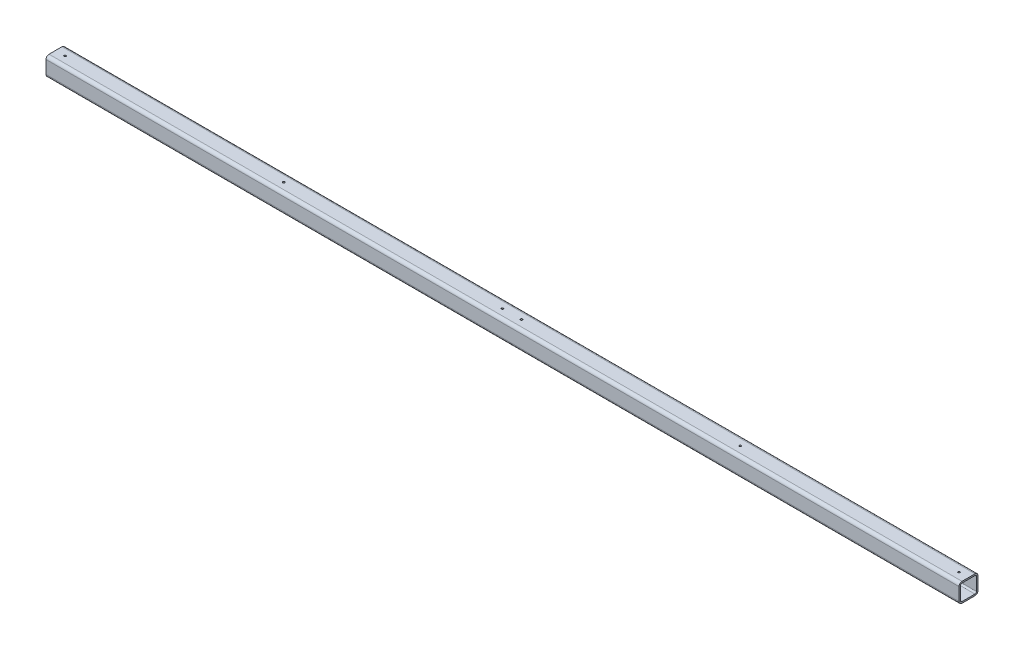
ISO-10303-21;
HEADER;
FILE_DESCRIPTION(('STEP AP214'),'2;1');
FILE_NAME('part.step','',(''),(''),'','','');
FILE_SCHEMA(('AUTOMOTIVE_DESIGN { 1 0 10303 214 1 1 1 1 }'));
ENDSEC;
DATA;
#1=APPLICATION_CONTEXT('core data for automotive mechanical design processes');
#2=APPLICATION_PROTOCOL_DEFINITION('international standard','automotive_design',2000,#1);
#3=PRODUCT_CONTEXT('',#1,'mechanical');
#4=PRODUCT('Part','Part','',(#3));
#5=PRODUCT_RELATED_PRODUCT_CATEGORY('part','',(#4));
#6=PRODUCT_DEFINITION_FORMATION('','',#4);
#7=PRODUCT_DEFINITION_CONTEXT('part definition',#1,'design');
#8=PRODUCT_DEFINITION('design','',#6,#7);
#9=PRODUCT_DEFINITION_SHAPE('','',#8);
#10=(LENGTH_UNIT() NAMED_UNIT(*) SI_UNIT(.MILLI.,.METRE.));
#11=(NAMED_UNIT(*) PLANE_ANGLE_UNIT() SI_UNIT($,.RADIAN.));
#12=(NAMED_UNIT(*) SI_UNIT($,.STERADIAN.) SOLID_ANGLE_UNIT());
#13=UNCERTAINTY_MEASURE_WITH_UNIT(LENGTH_MEASURE(1.E-05),#10,'distance_accuracy_value','');
#14=(GEOMETRIC_REPRESENTATION_CONTEXT(3) GLOBAL_UNCERTAINTY_ASSIGNED_CONTEXT((#13)) GLOBAL_UNIT_ASSIGNED_CONTEXT((#10,
#11,#12)) REPRESENTATION_CONTEXT('',''));
#15=CARTESIAN_POINT('',(0.,0.,0.));
#16=DIRECTION('',(0.,0.,1.));
#17=DIRECTION('',(1.,0.,0.));
#18=AXIS2_PLACEMENT_3D('',#15,#16,#17);
#19=CARTESIAN_POINT('',(1920.,13.6,-13.6));
#20=DIRECTION('',(-1.,0.,0.));
#21=DIRECTION('',(0.,0.,1.));
#22=AXIS2_PLACEMENT_3D('',#19,#20,#21);
#23=CYLINDRICAL_SURFACE('',#22,6.4);
#24=CARTESIAN_POINT('',(0.,13.6,-13.6));
#25=DIRECTION('',(1.,0.,0.));
#26=DIRECTION('',(0.,0.,-1.));
#27=AXIS2_PLACEMENT_3D('',#24,#25,#26);
#28=CIRCLE('',#27,6.4);
#29=CARTESIAN_POINT('',(0.,13.6,-20.));
#30=VERTEX_POINT('',#29);
#31=CARTESIAN_POINT('',(0.,20.,-13.6));
#32=VERTEX_POINT('',#31);
#33=EDGE_CURVE('E252',#30,#32,#28,.T.);
#34=ORIENTED_EDGE('',*,*,#33,.T.);
#35=DIRECTION('',(-1.,0.,0.));
#36=VECTOR('',#35,1.);
#37=CARTESIAN_POINT('',(1920.,20.,-13.6));
#38=LINE('',#37,#36);
#39=CARTESIAN_POINT('',(1920.,20.,-13.6));
#40=VERTEX_POINT('',#39);
#41=EDGE_CURVE('E12',#40,#32,#38,.T.);
#42=ORIENTED_EDGE('',*,*,#41,.F.);
#43=CARTESIAN_POINT('',(1920.,13.6,-13.6));
#44=DIRECTION('',(1.,0.,0.));
#45=DIRECTION('',(0.,0.,-1.));
#46=AXIS2_PLACEMENT_3D('',#43,#44,#45);
#47=CIRCLE('',#46,6.4);
#48=CARTESIAN_POINT('',(1920.,13.6,-20.));
#49=VERTEX_POINT('',#48);
#50=EDGE_CURVE('E358',#49,#40,#47,.T.);
#51=ORIENTED_EDGE('',*,*,#50,.F.);
#52=DIRECTION('',(-1.,0.,0.));
#53=VECTOR('',#52,1.);
#54=CARTESIAN_POINT('',(1920.,13.6,-20.));
#55=LINE('',#54,#53);
#56=EDGE_CURVE('E275',#49,#30,#55,.T.);
#57=ORIENTED_EDGE('',*,*,#56,.T.);
#58=EDGE_LOOP('',(#34,#42,#51,#57));
#59=FACE_BOUND('',#58,.T.);
#60=ADVANCED_FACE('F66',(#59),#23,.T.);
#61=CARTESIAN_POINT('',(1920.,20.,-13.6));
#62=DIRECTION('',(0.,-1.,0.));
#63=DIRECTION('',(0.,0.,-1.));
#64=AXIS2_PLACEMENT_3D('',#61,#62,#63);
#65=PLANE('',#64);
#66=CARTESIAN_POINT('',(20.,20.,0.));
#67=DIRECTION('',(0.,1.,0.));
#68=DIRECTION('',(0.,0.,1.));
#69=AXIS2_PLACEMENT_3D('',#66,#67,#68);
#70=CIRCLE('',#69,2.);
#71=CARTESIAN_POINT('',(20.,20.,2.));
#72=VERTEX_POINT('',#71);
#73=EDGE_CURVE('E666',#72,#72,#70,.T.);
#74=ORIENTED_EDGE('',*,*,#73,.F.);
#75=EDGE_LOOP('',(#74));
#76=FACE_BOUND('',#75,.T.);
#77=CARTESIAN_POINT('',(1440.,20.,0.));
#78=DIRECTION('',(0.,1.,0.));
#79=DIRECTION('',(0.,0.,1.));
#80=AXIS2_PLACEMENT_3D('',#77,#78,#79);
#81=CIRCLE('',#80,2.0000000000001);
#82=CARTESIAN_POINT('',(1440.,20.,2.0000000000001));
#83=VERTEX_POINT('',#82);
#84=EDGE_CURVE('E686',#83,#83,#81,.T.);
#85=ORIENTED_EDGE('',*,*,#84,.F.);
#86=EDGE_LOOP('',(#85));
#87=FACE_BOUND('',#86,.T.);
#88=CARTESIAN_POINT('',(940.,20.,0.));
#89=DIRECTION('',(0.,1.,0.));
#90=DIRECTION('',(0.,0.,1.));
#91=AXIS2_PLACEMENT_3D('',#88,#89,#90);
#92=CIRCLE('',#91,2.);
#93=CARTESIAN_POINT('',(940.,20.,2.));
#94=VERTEX_POINT('',#93);
#95=EDGE_CURVE('E678',#94,#94,#92,.T.);
#96=ORIENTED_EDGE('',*,*,#95,.F.);
#97=EDGE_LOOP('',(#96));
#98=FACE_BOUND('',#97,.T.);
#99=CARTESIAN_POINT('',(980.,20.,0.));
#100=DIRECTION('',(0.,1.,0.));
#101=DIRECTION('',(0.,0.,1.));
#102=AXIS2_PLACEMENT_3D('',#99,#100,#101);
#103=CIRCLE('',#102,2.);
#104=CARTESIAN_POINT('',(980.,20.,2.));
#105=VERTEX_POINT('',#104);
#106=EDGE_CURVE('E677',#105,#105,#103,.T.);
#107=ORIENTED_EDGE('',*,*,#106,.F.);
#108=EDGE_LOOP('',(#107));
#109=FACE_BOUND('',#108,.T.);
#110=CARTESIAN_POINT('',(1900.,20.,0.));
#111=DIRECTION('',(0.,1.,0.));
#112=DIRECTION('',(0.,0.,1.));
#113=AXIS2_PLACEMENT_3D('',#110,#111,#112);
#114=CIRCLE('',#113,2.0000000000001);
#115=CARTESIAN_POINT('',(1900.,20.,2.0000000000001));
#116=VERTEX_POINT('',#115);
#117=EDGE_CURVE('E694',#116,#116,#114,.T.);
#118=ORIENTED_EDGE('',*,*,#117,.F.);
#119=EDGE_LOOP('',(#118));
#120=FACE_BOUND('',#119,.T.);
#121=CARTESIAN_POINT('',(480.,20.,0.));
#122=DIRECTION('',(0.,1.,0.));
#123=DIRECTION('',(0.,0.,1.));
#124=AXIS2_PLACEMENT_3D('',#121,#122,#123);
#125=CIRCLE('',#124,2.);
#126=CARTESIAN_POINT('',(480.,20.,2.));
#127=VERTEX_POINT('',#126);
#128=EDGE_CURVE('E708',#127,#127,#125,.T.);
#129=ORIENTED_EDGE('',*,*,#128,.F.);
#130=EDGE_LOOP('',(#129));
#131=FACE_BOUND('',#130,.T.);
#132=DIRECTION('',(0.,0.,1.));
#133=VECTOR('',#132,1.);
#134=CARTESIAN_POINT('',(0.,20.,-13.6));
#135=LINE('',#134,#133);
#136=CARTESIAN_POINT('',(0.,20.,13.6));
#137=VERTEX_POINT('',#136);
#138=EDGE_CURVE('E256',#32,#137,#135,.T.);
#139=ORIENTED_EDGE('',*,*,#138,.T.);
#140=DIRECTION('',(-1.,0.,0.));
#141=VECTOR('',#140,1.);
#142=CARTESIAN_POINT('',(1920.,20.,13.6));
#143=LINE('',#142,#141);
#144=CARTESIAN_POINT('',(1920.,20.,13.6));
#145=VERTEX_POINT('',#144);
#146=EDGE_CURVE('E77',#145,#137,#143,.T.);
#147=ORIENTED_EDGE('',*,*,#146,.F.);
#148=DIRECTION('',(0.,0.,1.));
#149=VECTOR('',#148,1.);
#150=CARTESIAN_POINT('',(1920.,20.,-13.6));
#151=LINE('',#150,#149);
#152=EDGE_CURVE('E361',#40,#145,#151,.T.);
#153=ORIENTED_EDGE('',*,*,#152,.F.);
#154=ORIENTED_EDGE('',*,*,#41,.T.);
#155=EDGE_LOOP('',(#139,#147,#153,#154));
#156=FACE_BOUND('',#155,.T.);
#157=ADVANCED_FACE('F400',(#76,#87,#98,#109,#120,#131,#156),#65,.F.);
#158=CARTESIAN_POINT('',(1920.,13.6,13.6));
#159=DIRECTION('',(-1.,0.,0.));
#160=DIRECTION('',(0.,0.,1.));
#161=AXIS2_PLACEMENT_3D('',#158,#159,#160);
#162=CYLINDRICAL_SURFACE('',#161,6.4);
#163=CARTESIAN_POINT('',(0.,13.6,13.6));
#164=DIRECTION('',(1.,0.,0.));
#165=DIRECTION('',(0.,0.,-1.));
#166=AXIS2_PLACEMENT_3D('',#163,#164,#165);
#167=CIRCLE('',#166,6.4);
#168=CARTESIAN_POINT('',(0.,13.6,20.));
#169=VERTEX_POINT('',#168);
#170=EDGE_CURVE('E259',#137,#169,#167,.T.);
#171=ORIENTED_EDGE('',*,*,#170,.T.);
#172=DIRECTION('',(-1.,0.,0.));
#173=VECTOR('',#172,1.);
#174=CARTESIAN_POINT('',(1920.,13.6,20.));
#175=LINE('',#174,#173);
#176=CARTESIAN_POINT('',(1920.,13.6,20.));
#177=VERTEX_POINT('',#176);
#178=EDGE_CURVE('E286',#177,#169,#175,.T.);
#179=ORIENTED_EDGE('',*,*,#178,.F.);
#180=CARTESIAN_POINT('',(1920.,13.6,13.6));
#181=DIRECTION('',(1.,0.,0.));
#182=DIRECTION('',(0.,0.,-1.));
#183=AXIS2_PLACEMENT_3D('',#180,#181,#182);
#184=CIRCLE('',#183,6.4);
#185=EDGE_CURVE('E364',#145,#177,#184,.T.);
#186=ORIENTED_EDGE('',*,*,#185,.F.);
#187=ORIENTED_EDGE('',*,*,#146,.T.);
#188=EDGE_LOOP('',(#171,#179,#186,#187));
#189=FACE_BOUND('',#188,.T.);
#190=ADVANCED_FACE('F406',(#189),#162,.T.);
#191=CARTESIAN_POINT('',(1920.,-13.6,20.));
#192=DIRECTION('',(0.,0.,-1.));
#193=DIRECTION('',(0.,1.,0.));
#194=AXIS2_PLACEMENT_3D('',#191,#192,#193);
#195=PLANE('',#194);
#196=DIRECTION('',(0.,-1.,0.));
#197=VECTOR('',#196,1.);
#198=CARTESIAN_POINT('',(0.,-13.6,20.));
#199=LINE('',#198,#197);
#200=CARTESIAN_POINT('',(0.,-13.6,20.));
#201=VERTEX_POINT('',#200);
#202=EDGE_CURVE('E262',#169,#201,#199,.T.);
#203=ORIENTED_EDGE('',*,*,#202,.T.);
#204=DIRECTION('',(-1.,0.,0.));
#205=VECTOR('',#204,1.);
#206=CARTESIAN_POINT('',(1920.,-13.6,20.));
#207=LINE('',#206,#205);
#208=CARTESIAN_POINT('',(1920.,-13.6,20.));
#209=VERTEX_POINT('',#208);
#210=EDGE_CURVE('E282',#209,#201,#207,.T.);
#211=ORIENTED_EDGE('',*,*,#210,.F.);
#212=DIRECTION('',(0.,-1.,0.));
#213=VECTOR('',#212,1.);
#214=CARTESIAN_POINT('',(1920.,-13.6,20.));
#215=LINE('',#214,#213);
#216=EDGE_CURVE('E367',#177,#209,#215,.T.);
#217=ORIENTED_EDGE('',*,*,#216,.F.);
#218=ORIENTED_EDGE('',*,*,#178,.T.);
#219=EDGE_LOOP('',(#203,#211,#217,#218));
#220=FACE_BOUND('',#219,.T.);
#221=ADVANCED_FACE('F375',(#220),#195,.F.);
#222=CARTESIAN_POINT('',(1920.,-13.6,13.6));
#223=DIRECTION('',(-1.,0.,0.));
#224=DIRECTION('',(0.,0.,1.));
#225=AXIS2_PLACEMENT_3D('',#222,#223,#224);
#226=CYLINDRICAL_SURFACE('',#225,6.4);
#227=CARTESIAN_POINT('',(0.,-13.6,13.6));
#228=DIRECTION('',(1.,0.,0.));
#229=DIRECTION('',(0.,0.,-1.));
#230=AXIS2_PLACEMENT_3D('',#227,#228,#229);
#231=CIRCLE('',#230,6.4);
#232=CARTESIAN_POINT('',(0.,-20.,13.6));
#233=VERTEX_POINT('',#232);
#234=EDGE_CURVE('E265',#201,#233,#231,.T.);
#235=ORIENTED_EDGE('',*,*,#234,.T.);
#236=DIRECTION('',(-1.,0.,0.));
#237=VECTOR('',#236,1.);
#238=CARTESIAN_POINT('',(1920.,-20.,13.6));
#239=LINE('',#238,#237);
#240=CARTESIAN_POINT('',(1920.,-20.,13.6));
#241=VERTEX_POINT('',#240);
#242=EDGE_CURVE('E208',#241,#233,#239,.T.);
#243=ORIENTED_EDGE('',*,*,#242,.F.);
#244=CARTESIAN_POINT('',(1920.,-13.6,13.6));
#245=DIRECTION('',(1.,0.,0.));
#246=DIRECTION('',(0.,0.,-1.));
#247=AXIS2_PLACEMENT_3D('',#244,#245,#246);
#248=CIRCLE('',#247,6.4);
#249=EDGE_CURVE('E197',#209,#241,#248,.T.);
#250=ORIENTED_EDGE('',*,*,#249,.F.);
#251=ORIENTED_EDGE('',*,*,#210,.T.);
#252=EDGE_LOOP('',(#235,#243,#250,#251));
#253=FACE_BOUND('',#252,.T.);
#254=ADVANCED_FACE('F379',(#253),#226,.T.);
#255=CARTESIAN_POINT('',(1920.,-20.,13.6));
#256=DIRECTION('',(0.,1.,0.));
#257=DIRECTION('',(0.,0.,1.));
#258=AXIS2_PLACEMENT_3D('',#255,#256,#257);
#259=PLANE('',#258);
#260=DIRECTION('',(0.,0.,-1.));
#261=VECTOR('',#260,1.);
#262=CARTESIAN_POINT('',(0.,-20.,13.6));
#263=LINE('',#262,#261);
#264=CARTESIAN_POINT('',(0.,-20.,-13.6));
#265=VERTEX_POINT('',#264);
#266=EDGE_CURVE('E206',#233,#265,#263,.T.);
#267=ORIENTED_EDGE('',*,*,#266,.T.);
#268=DIRECTION('',(-1.,0.,0.));
#269=VECTOR('',#268,1.);
#270=CARTESIAN_POINT('',(1920.,-20.,-13.6));
#271=LINE('',#270,#269);
#272=CARTESIAN_POINT('',(1920.,-20.,-13.6));
#273=VERTEX_POINT('',#272);
#274=EDGE_CURVE('E203',#273,#265,#271,.T.);
#275=ORIENTED_EDGE('',*,*,#274,.F.);
#276=DIRECTION('',(0.,0.,-1.));
#277=VECTOR('',#276,1.);
#278=CARTESIAN_POINT('',(1920.,-20.,13.6));
#279=LINE('',#278,#277);
#280=EDGE_CURVE('E191',#241,#273,#279,.T.);
#281=ORIENTED_EDGE('',*,*,#280,.F.);
#282=ORIENTED_EDGE('',*,*,#242,.T.);
#283=EDGE_LOOP('',(#267,#275,#281,#282));
#284=FACE_BOUND('',#283,.T.);
#285=ADVANCED_FACE('F204',(#284),#259,.F.);
#286=CARTESIAN_POINT('',(1920.,-13.6,-13.6));
#287=DIRECTION('',(-1.,0.,0.));
#288=DIRECTION('',(0.,0.,1.));
#289=AXIS2_PLACEMENT_3D('',#286,#287,#288);
#290=CYLINDRICAL_SURFACE('',#289,6.4);
#291=CARTESIAN_POINT('',(0.,-13.6,-13.6));
#292=DIRECTION('',(1.,0.,0.));
#293=DIRECTION('',(0.,0.,-1.));
#294=AXIS2_PLACEMENT_3D('',#291,#292,#293);
#295=CIRCLE('',#294,6.4);
#296=CARTESIAN_POINT('',(0.,-13.6,-20.));
#297=VERTEX_POINT('',#296);
#298=EDGE_CURVE('E139',#265,#297,#295,.T.);
#299=ORIENTED_EDGE('',*,*,#298,.T.);
#300=DIRECTION('',(-1.,0.,0.));
#301=VECTOR('',#300,1.);
#302=CARTESIAN_POINT('',(1920.,-13.6,-20.));
#303=LINE('',#302,#301);
#304=CARTESIAN_POINT('',(1920.,-13.6,-20.));
#305=VERTEX_POINT('',#304);
#306=EDGE_CURVE('E209',#305,#297,#303,.T.);
#307=ORIENTED_EDGE('',*,*,#306,.F.);
#308=CARTESIAN_POINT('',(1920.,-13.6,-13.6));
#309=DIRECTION('',(1.,0.,0.));
#310=DIRECTION('',(0.,0.,-1.));
#311=AXIS2_PLACEMENT_3D('',#308,#309,#310);
#312=CIRCLE('',#311,6.4);
#313=EDGE_CURVE('E195',#273,#305,#312,.T.);
#314=ORIENTED_EDGE('',*,*,#313,.F.);
#315=ORIENTED_EDGE('',*,*,#274,.T.);
#316=EDGE_LOOP('',(#299,#307,#314,#315));
#317=FACE_BOUND('',#316,.T.);
#318=ADVANCED_FACE('F211',(#317),#290,.T.);
#319=CARTESIAN_POINT('',(1920.,13.6,13.6));
#320=DIRECTION('',(-1.,0.,0.));
#321=DIRECTION('',(0.,0.,1.));
#322=AXIS2_PLACEMENT_3D('',#319,#320,#321);
#323=CYLINDRICAL_SURFACE('',#322,3.2);
#324=CARTESIAN_POINT('',(0.,13.6,13.6));
#325=DIRECTION('',(1.,0.,0.));
#326=DIRECTION('',(0.,0.,-1.));
#327=AXIS2_PLACEMENT_3D('',#324,#325,#326);
#328=CIRCLE('',#327,3.2);
#329=CARTESIAN_POINT('',(0.,16.8,13.6));
#330=VERTEX_POINT('',#329);
#331=CARTESIAN_POINT('',(0.,13.6,16.8));
#332=VERTEX_POINT('',#331);
#333=EDGE_CURVE('E219',#330,#332,#328,.T.);
#334=ORIENTED_EDGE('',*,*,#333,.F.);
#335=DIRECTION('',(-1.,0.,0.));
#336=VECTOR('',#335,1.);
#337=CARTESIAN_POINT('',(1920.,16.8,13.6));
#338=LINE('',#337,#336);
#339=CARTESIAN_POINT('',(1920.,16.8,13.6));
#340=VERTEX_POINT('',#339);
#341=EDGE_CURVE('E70',#340,#330,#338,.T.);
#342=ORIENTED_EDGE('',*,*,#341,.F.);
#343=CARTESIAN_POINT('',(1920.,13.6,13.6));
#344=DIRECTION('',(1.,0.,0.));
#345=DIRECTION('',(0.,0.,-1.));
#346=AXIS2_PLACEMENT_3D('',#343,#344,#345);
#347=CIRCLE('',#346,3.2);
#348=CARTESIAN_POINT('',(1920.,13.6,16.8));
#349=VERTEX_POINT('',#348);
#350=EDGE_CURVE('E274',#340,#349,#347,.T.);
#351=ORIENTED_EDGE('',*,*,#350,.T.);
#352=DIRECTION('',(-1.,0.,0.));
#353=VECTOR('',#352,1.);
#354=CARTESIAN_POINT('',(1920.,13.6,16.8));
#355=LINE('',#354,#353);
#356=EDGE_CURVE('E215',#349,#332,#355,.T.);
#357=ORIENTED_EDGE('',*,*,#356,.T.);
#358=EDGE_LOOP('',(#334,#342,#351,#357));
#359=FACE_BOUND('',#358,.T.);
#360=ADVANCED_FACE('F68',(#359),#323,.F.);
#361=CARTESIAN_POINT('',(1920.,16.8,-13.6));
#362=DIRECTION('',(0.,-1.,0.));
#363=DIRECTION('',(0.,0.,-1.));
#364=AXIS2_PLACEMENT_3D('',#361,#362,#363);
#365=PLANE('',#364);
#366=DIRECTION('',(0.,0.,1.));
#367=VECTOR('',#366,1.);
#368=CARTESIAN_POINT('',(0.,16.8,-13.6));
#369=LINE('',#368,#367);
#370=CARTESIAN_POINT('',(0.,16.8,-13.6));
#371=VERTEX_POINT('',#370);
#372=EDGE_CURVE('E223',#371,#330,#369,.T.);
#373=ORIENTED_EDGE('',*,*,#372,.F.);
#374=DIRECTION('',(-1.,0.,0.));
#375=VECTOR('',#374,1.);
#376=CARTESIAN_POINT('',(1920.,16.8,-13.6));
#377=LINE('',#376,#375);
#378=CARTESIAN_POINT('',(1920.,16.8,-13.6));
#379=VERTEX_POINT('',#378);
#380=EDGE_CURVE('E309',#379,#371,#377,.T.);
#381=ORIENTED_EDGE('',*,*,#380,.F.);
#382=DIRECTION('',(0.,0.,1.));
#383=VECTOR('',#382,1.);
#384=CARTESIAN_POINT('',(1920.,16.8,-13.6));
#385=LINE('',#384,#383);
#386=EDGE_CURVE('E320',#379,#340,#385,.T.);
#387=ORIENTED_EDGE('',*,*,#386,.T.);
#388=ORIENTED_EDGE('',*,*,#341,.T.);
#389=EDGE_LOOP('',(#373,#381,#387,#388));
#390=FACE_BOUND('',#389,.T.);
#391=ADVANCED_FACE('F318',(#390),#365,.T.);
#392=CARTESIAN_POINT('',(1920.,13.6,-13.6));
#393=DIRECTION('',(-1.,0.,0.));
#394=DIRECTION('',(0.,0.,1.));
#395=AXIS2_PLACEMENT_3D('',#392,#393,#394);
#396=CYLINDRICAL_SURFACE('',#395,3.2);
#397=CARTESIAN_POINT('',(0.,13.6,-13.6));
#398=DIRECTION('',(1.,0.,0.));
#399=DIRECTION('',(0.,0.,-1.));
#400=AXIS2_PLACEMENT_3D('',#397,#398,#399);
#401=CIRCLE('',#400,3.2);
#402=CARTESIAN_POINT('',(0.,13.6,-16.8));
#403=VERTEX_POINT('',#402);
#404=EDGE_CURVE('E228',#403,#371,#401,.T.);
#405=ORIENTED_EDGE('',*,*,#404,.F.);
#406=DIRECTION('',(-1.,0.,0.));
#407=VECTOR('',#406,1.);
#408=CARTESIAN_POINT('',(1920.,13.6,-16.8));
#409=LINE('',#408,#407);
#410=CARTESIAN_POINT('',(1920.,13.6,-16.8));
#411=VERTEX_POINT('',#410);
#412=EDGE_CURVE('E307',#411,#403,#409,.T.);
#413=ORIENTED_EDGE('',*,*,#412,.F.);
#414=CARTESIAN_POINT('',(1920.,13.6,-13.6));
#415=DIRECTION('',(1.,0.,0.));
#416=DIRECTION('',(0.,0.,-1.));
#417=AXIS2_PLACEMENT_3D('',#414,#415,#416);
#418=CIRCLE('',#417,3.2);
#419=EDGE_CURVE('E328',#411,#379,#418,.T.);
#420=ORIENTED_EDGE('',*,*,#419,.T.);
#421=ORIENTED_EDGE('',*,*,#380,.T.);
#422=EDGE_LOOP('',(#405,#413,#420,#421));
#423=FACE_BOUND('',#422,.T.);
#424=ADVANCED_FACE('F326',(#423),#396,.F.);
#425=CARTESIAN_POINT('',(1920.,13.6,-16.8));
#426=DIRECTION('',(0.,0.,1.));
#427=DIRECTION('',(1.,0.,0.));
#428=AXIS2_PLACEMENT_3D('',#425,#426,#427);
#429=PLANE('',#428);
#430=DIRECTION('',(0.,1.,0.));
#431=VECTOR('',#430,1.);
#432=CARTESIAN_POINT('',(0.,13.6,-16.8));
#433=LINE('',#432,#431);
#434=CARTESIAN_POINT('',(0.,-13.6,-16.8));
#435=VERTEX_POINT('',#434);
#436=EDGE_CURVE('E232',#435,#403,#433,.T.);
#437=ORIENTED_EDGE('',*,*,#436,.F.);
#438=DIRECTION('',(-1.,0.,0.));
#439=VECTOR('',#438,1.);
#440=CARTESIAN_POINT('',(1920.,-13.6,-16.8));
#441=LINE('',#440,#439);
#442=CARTESIAN_POINT('',(1920.,-13.6,-16.8));
#443=VERTEX_POINT('',#442);
#444=EDGE_CURVE('E304',#443,#435,#441,.T.);
#445=ORIENTED_EDGE('',*,*,#444,.F.);
#446=DIRECTION('',(0.,1.,0.));
#447=VECTOR('',#446,1.);
#448=CARTESIAN_POINT('',(1920.,13.6,-16.8));
#449=LINE('',#448,#447);
#450=EDGE_CURVE('E334',#443,#411,#449,.T.);
#451=ORIENTED_EDGE('',*,*,#450,.T.);
#452=ORIENTED_EDGE('',*,*,#412,.T.);
#453=EDGE_LOOP('',(#437,#445,#451,#452));
#454=FACE_BOUND('',#453,.T.);
#455=ADVANCED_FACE('F338',(#454),#429,.T.);
#456=CARTESIAN_POINT('',(1920.,-13.6,-13.6));
#457=DIRECTION('',(-1.,0.,0.));
#458=DIRECTION('',(0.,0.,1.));
#459=AXIS2_PLACEMENT_3D('',#456,#457,#458);
#460=CYLINDRICAL_SURFACE('',#459,3.2);
#461=CARTESIAN_POINT('',(0.,-13.6,-13.6));
#462=DIRECTION('',(1.,0.,0.));
#463=DIRECTION('',(0.,0.,-1.));
#464=AXIS2_PLACEMENT_3D('',#461,#462,#463);
#465=CIRCLE('',#464,3.2);
#466=CARTESIAN_POINT('',(0.,-16.8,-13.6));
#467=VERTEX_POINT('',#466);
#468=EDGE_CURVE('E236',#467,#435,#465,.T.);
#469=ORIENTED_EDGE('',*,*,#468,.F.);
#470=DIRECTION('',(-1.,0.,0.));
#471=VECTOR('',#470,1.);
#472=CARTESIAN_POINT('',(1920.,-16.8,-13.6));
#473=LINE('',#472,#471);
#474=CARTESIAN_POINT('',(1920.,-16.8,-13.6));
#475=VERTEX_POINT('',#474);
#476=EDGE_CURVE('E301',#475,#467,#473,.T.);
#477=ORIENTED_EDGE('',*,*,#476,.F.);
#478=CARTESIAN_POINT('',(1920.,-13.6,-13.6));
#479=DIRECTION('',(1.,0.,0.));
#480=DIRECTION('',(0.,0.,-1.));
#481=AXIS2_PLACEMENT_3D('',#478,#479,#480);
#482=CIRCLE('',#481,3.2);
#483=EDGE_CURVE('E340',#475,#443,#482,.T.);
#484=ORIENTED_EDGE('',*,*,#483,.T.);
#485=ORIENTED_EDGE('',*,*,#444,.T.);
#486=EDGE_LOOP('',(#469,#477,#484,#485));
#487=FACE_BOUND('',#486,.T.);
#488=ADVANCED_FACE('F417',(#487),#460,.F.);
#489=CARTESIAN_POINT('',(1920.,-16.8,13.6));
#490=DIRECTION('',(0.,1.,0.));
#491=DIRECTION('',(0.,0.,1.));
#492=AXIS2_PLACEMENT_3D('',#489,#490,#491);
#493=PLANE('',#492);
#494=DIRECTION('',(0.,0.,-1.));
#495=VECTOR('',#494,1.);
#496=CARTESIAN_POINT('',(0.,-16.8,13.6));
#497=LINE('',#496,#495);
#498=CARTESIAN_POINT('',(0.,-16.8,13.6));
#499=VERTEX_POINT('',#498);
#500=EDGE_CURVE('E240',#499,#467,#497,.T.);
#501=ORIENTED_EDGE('',*,*,#500,.F.);
#502=DIRECTION('',(-1.,0.,0.));
#503=VECTOR('',#502,1.);
#504=CARTESIAN_POINT('',(1920.,-16.8,13.6));
#505=LINE('',#504,#503);
#506=CARTESIAN_POINT('',(1920.,-16.8,13.6));
#507=VERTEX_POINT('',#506);
#508=EDGE_CURVE('E298',#507,#499,#505,.T.);
#509=ORIENTED_EDGE('',*,*,#508,.F.);
#510=DIRECTION('',(0.,0.,-1.));
#511=VECTOR('',#510,1.);
#512=CARTESIAN_POINT('',(1920.,-16.8,13.6));
#513=LINE('',#512,#511);
#514=EDGE_CURVE('E343',#507,#475,#513,.T.);
#515=ORIENTED_EDGE('',*,*,#514,.T.);
#516=ORIENTED_EDGE('',*,*,#476,.T.);
#517=EDGE_LOOP('',(#501,#509,#515,#516));
#518=FACE_BOUND('',#517,.T.);
#519=ADVANCED_FACE('F413',(#518),#493,.T.);
#520=CARTESIAN_POINT('',(1920.,-13.6,13.6));
#521=DIRECTION('',(-1.,0.,0.));
#522=DIRECTION('',(0.,0.,1.));
#523=AXIS2_PLACEMENT_3D('',#520,#521,#522);
#524=CYLINDRICAL_SURFACE('',#523,3.2);
#525=CARTESIAN_POINT('',(0.,-13.6,13.6));
#526=DIRECTION('',(1.,0.,0.));
#527=DIRECTION('',(0.,0.,-1.));
#528=AXIS2_PLACEMENT_3D('',#525,#526,#527);
#529=CIRCLE('',#528,3.2);
#530=CARTESIAN_POINT('',(0.,-13.6,16.8));
#531=VERTEX_POINT('',#530);
#532=EDGE_CURVE('E244',#531,#499,#529,.T.);
#533=ORIENTED_EDGE('',*,*,#532,.F.);
#534=DIRECTION('',(-1.,0.,0.));
#535=VECTOR('',#534,1.);
#536=CARTESIAN_POINT('',(1920.,-13.6,16.8));
#537=LINE('',#536,#535);
#538=CARTESIAN_POINT('',(1920.,-13.6,16.8));
#539=VERTEX_POINT('',#538);
#540=EDGE_CURVE('E295',#539,#531,#537,.T.);
#541=ORIENTED_EDGE('',*,*,#540,.F.);
#542=CARTESIAN_POINT('',(1920.,-13.6,13.6));
#543=DIRECTION('',(1.,0.,0.));
#544=DIRECTION('',(0.,0.,-1.));
#545=AXIS2_PLACEMENT_3D('',#542,#543,#544);
#546=CIRCLE('',#545,3.2);
#547=EDGE_CURVE('E350',#539,#507,#546,.T.);
#548=ORIENTED_EDGE('',*,*,#547,.T.);
#549=ORIENTED_EDGE('',*,*,#508,.T.);
#550=EDGE_LOOP('',(#533,#541,#548,#549));
#551=FACE_BOUND('',#550,.T.);
#552=ADVANCED_FACE('F394',(#551),#524,.F.);
#553=CARTESIAN_POINT('',(1920.,-13.6,16.8));
#554=DIRECTION('',(0.,0.,-1.));
#555=DIRECTION('',(0.,1.,0.));
#556=AXIS2_PLACEMENT_3D('',#553,#554,#555);
#557=PLANE('',#556);
#558=DIRECTION('',(0.,-1.,0.));
#559=VECTOR('',#558,1.);
#560=CARTESIAN_POINT('',(0.,-13.6,16.8));
#561=LINE('',#560,#559);
#562=EDGE_CURVE('E248',#332,#531,#561,.T.);
#563=ORIENTED_EDGE('',*,*,#562,.F.);
#564=ORIENTED_EDGE('',*,*,#356,.F.);
#565=DIRECTION('',(0.,-1.,0.));
#566=VECTOR('',#565,1.);
#567=CARTESIAN_POINT('',(1920.,-13.6,16.8));
#568=LINE('',#567,#566);
#569=EDGE_CURVE('E354',#349,#539,#568,.T.);
#570=ORIENTED_EDGE('',*,*,#569,.T.);
#571=ORIENTED_EDGE('',*,*,#540,.T.);
#572=EDGE_LOOP('',(#563,#564,#570,#571));
#573=FACE_BOUND('',#572,.T.);
#574=ADVANCED_FACE('F387',(#573),#557,.T.);
#575=CARTESIAN_POINT('',(1920.,13.6,-20.));
#576=DIRECTION('',(0.,0.,1.));
#577=DIRECTION('',(1.,0.,0.));
#578=AXIS2_PLACEMENT_3D('',#575,#576,#577);
#579=PLANE('',#578);
#580=DIRECTION('',(0.,1.,0.));
#581=VECTOR('',#580,1.);
#582=CARTESIAN_POINT('',(0.,13.6,-20.));
#583=LINE('',#582,#581);
#584=EDGE_CURVE('E145',#297,#30,#583,.T.);
#585=ORIENTED_EDGE('',*,*,#584,.T.);
#586=ORIENTED_EDGE('',*,*,#56,.F.);
#587=DIRECTION('',(0.,1.,0.));
#588=VECTOR('',#587,1.);
#589=CARTESIAN_POINT('',(1920.,13.6,-20.));
#590=LINE('',#589,#588);
#591=EDGE_CURVE('E86',#305,#49,#590,.T.);
#592=ORIENTED_EDGE('',*,*,#591,.F.);
#593=ORIENTED_EDGE('',*,*,#306,.T.);
#594=EDGE_LOOP('',(#585,#586,#592,#593));
#595=FACE_BOUND('',#594,.T.);
#596=ADVANCED_FACE('F385',(#595),#579,.F.);
#597=CARTESIAN_POINT('',(1920.,13.6,-13.6));
#598=DIRECTION('',(1.,0.,0.));
#599=DIRECTION('',(0.,0.,-1.));
#600=AXIS2_PLACEMENT_3D('',#597,#598,#599);
#601=PLANE('',#600);
#602=ORIENTED_EDGE('',*,*,#350,.F.);
#603=ORIENTED_EDGE('',*,*,#386,.F.);
#604=ORIENTED_EDGE('',*,*,#419,.F.);
#605=ORIENTED_EDGE('',*,*,#450,.F.);
#606=ORIENTED_EDGE('',*,*,#483,.F.);
#607=ORIENTED_EDGE('',*,*,#514,.F.);
#608=ORIENTED_EDGE('',*,*,#547,.F.);
#609=ORIENTED_EDGE('',*,*,#569,.F.);
#610=EDGE_LOOP('',(#602,#603,#604,#605,#606,#607,#608,#609));
#611=FACE_BOUND('',#610,.T.);
#612=ORIENTED_EDGE('',*,*,#50,.T.);
#613=ORIENTED_EDGE('',*,*,#152,.T.);
#614=ORIENTED_EDGE('',*,*,#185,.T.);
#615=ORIENTED_EDGE('',*,*,#216,.T.);
#616=ORIENTED_EDGE('',*,*,#249,.T.);
#617=ORIENTED_EDGE('',*,*,#280,.T.);
#618=ORIENTED_EDGE('',*,*,#313,.T.);
#619=ORIENTED_EDGE('',*,*,#591,.T.);
#620=EDGE_LOOP('',(#612,#613,#614,#615,#616,#617,#618,#619));
#621=FACE_BOUND('',#620,.T.);
#622=ADVANCED_FACE('F193',(#611,#621),#601,.T.);
#623=CARTESIAN_POINT('',(0.,13.6,-13.6));
#624=DIRECTION('',(1.,0.,0.));
#625=DIRECTION('',(0.,0.,-1.));
#626=AXIS2_PLACEMENT_3D('',#623,#624,#625);
#627=PLANE('',#626);
#628=ORIENTED_EDGE('',*,*,#333,.T.);
#629=ORIENTED_EDGE('',*,*,#562,.T.);
#630=ORIENTED_EDGE('',*,*,#532,.T.);
#631=ORIENTED_EDGE('',*,*,#500,.T.);
#632=ORIENTED_EDGE('',*,*,#468,.T.);
#633=ORIENTED_EDGE('',*,*,#436,.T.);
#634=ORIENTED_EDGE('',*,*,#404,.T.);
#635=ORIENTED_EDGE('',*,*,#372,.T.);
#636=EDGE_LOOP('',(#628,#629,#630,#631,#632,#633,#634,#635));
#637=FACE_BOUND('',#636,.T.);
#638=ORIENTED_EDGE('',*,*,#33,.F.);
#639=ORIENTED_EDGE('',*,*,#584,.F.);
#640=ORIENTED_EDGE('',*,*,#298,.F.);
#641=ORIENTED_EDGE('',*,*,#266,.F.);
#642=ORIENTED_EDGE('',*,*,#234,.F.);
#643=ORIENTED_EDGE('',*,*,#202,.F.);
#644=ORIENTED_EDGE('',*,*,#170,.F.);
#645=ORIENTED_EDGE('',*,*,#138,.F.);
#646=EDGE_LOOP('',(#638,#639,#640,#641,#642,#643,#644,#645));
#647=FACE_BOUND('',#646,.T.);
#648=ADVANCED_FACE('F323',(#637,#647),#627,.F.);
#649=CARTESIAN_POINT('',(480.,17.,0.));
#650=DIRECTION('',(0.,1.,0.));
#651=DIRECTION('',(0.,0.,1.));
#652=AXIS2_PLACEMENT_3D('',#649,#650,#651);
#653=CYLINDRICAL_SURFACE('',#652,2.);
#654=CARTESIAN_POINT('',(480.,17.,0.));
#655=DIRECTION('',(0.,1.,0.));
#656=DIRECTION('',(0.,0.,1.));
#657=AXIS2_PLACEMENT_3D('',#654,#655,#656);
#658=CIRCLE('',#657,2.);
#659=CARTESIAN_POINT('',(480.,17.,2.));
#660=VERTEX_POINT('',#659);
#661=EDGE_CURVE('E690',#660,#660,#658,.T.);
#662=ORIENTED_EDGE('',*,*,#661,.F.);
#663=EDGE_LOOP('',(#662));
#664=FACE_BOUND('',#663,.T.);
#665=ORIENTED_EDGE('',*,*,#128,.T.);
#666=EDGE_LOOP('',(#665));
#667=FACE_BOUND('',#666,.T.);
#668=ADVANCED_FACE('F538',(#664,#667),#653,.F.);
#669=CARTESIAN_POINT('',(480.,17.,0.));
#670=DIRECTION('',(0.,1.,0.));
#671=DIRECTION('',(0.,0.,1.));
#672=AXIS2_PLACEMENT_3D('',#669,#670,#671);
#673=PLANE('',#672);
#674=ORIENTED_EDGE('',*,*,#661,.T.);
#675=EDGE_LOOP('',(#674));
#676=FACE_BOUND('',#675,.T.);
#677=ADVANCED_FACE('F549',(#676),#673,.T.);
#678=CARTESIAN_POINT('',(1900.,17.,0.));
#679=DIRECTION('',(0.,1.,0.));
#680=DIRECTION('',(0.,0.,1.));
#681=AXIS2_PLACEMENT_3D('',#678,#679,#680);
#682=CYLINDRICAL_SURFACE('',#681,2.0000000000001);
#683=CARTESIAN_POINT('',(1900.,17.,0.));
#684=DIRECTION('',(0.,1.,0.));
#685=DIRECTION('',(0.,0.,1.));
#686=AXIS2_PLACEMENT_3D('',#683,#684,#685);
#687=CIRCLE('',#686,2.0000000000001);
#688=CARTESIAN_POINT('',(1900.,17.,2.0000000000001));
#689=VERTEX_POINT('',#688);
#690=EDGE_CURVE('E670',#689,#689,#687,.T.);
#691=ORIENTED_EDGE('',*,*,#690,.F.);
#692=EDGE_LOOP('',(#691));
#693=FACE_BOUND('',#692,.T.);
#694=ORIENTED_EDGE('',*,*,#117,.T.);
#695=EDGE_LOOP('',(#694));
#696=FACE_BOUND('',#695,.T.);
#697=ADVANCED_FACE('F559',(#693,#696),#682,.F.);
#698=CARTESIAN_POINT('',(1900.,17.,0.));
#699=DIRECTION('',(0.,1.,0.));
#700=DIRECTION('',(0.,0.,1.));
#701=AXIS2_PLACEMENT_3D('',#698,#699,#700);
#702=PLANE('',#701);
#703=ORIENTED_EDGE('',*,*,#690,.T.);
#704=EDGE_LOOP('',(#703));
#705=FACE_BOUND('',#704,.T.);
#706=ADVANCED_FACE('F569',(#705),#702,.T.);
#707=CARTESIAN_POINT('',(980.,17.,0.));
#708=DIRECTION('',(0.,1.,0.));
#709=DIRECTION('',(0.,0.,1.));
#710=AXIS2_PLACEMENT_3D('',#707,#708,#709);
#711=CYLINDRICAL_SURFACE('',#710,2.);
#712=CARTESIAN_POINT('',(980.,17.,0.));
#713=DIRECTION('',(0.,1.,0.));
#714=DIRECTION('',(0.,0.,1.));
#715=AXIS2_PLACEMENT_3D('',#712,#713,#714);
#716=CIRCLE('',#715,2.);
#717=CARTESIAN_POINT('',(980.,17.,2.));
#718=VERTEX_POINT('',#717);
#719=EDGE_CURVE('E698',#718,#718,#716,.T.);
#720=ORIENTED_EDGE('',*,*,#719,.F.);
#721=EDGE_LOOP('',(#720));
#722=FACE_BOUND('',#721,.T.);
#723=ORIENTED_EDGE('',*,*,#106,.T.);
#724=EDGE_LOOP('',(#723));
#725=FACE_BOUND('',#724,.T.);
#726=ADVANCED_FACE('F579',(#722,#725),#711,.F.);
#727=CARTESIAN_POINT('',(980.,17.,0.));
#728=DIRECTION('',(0.,1.,0.));
#729=DIRECTION('',(0.,0.,1.));
#730=AXIS2_PLACEMENT_3D('',#727,#728,#729);
#731=PLANE('',#730);
#732=ORIENTED_EDGE('',*,*,#719,.T.);
#733=EDGE_LOOP('',(#732));
#734=FACE_BOUND('',#733,.T.);
#735=ADVANCED_FACE('F589',(#734),#731,.T.);
#736=CARTESIAN_POINT('',(940.,17.,0.));
#737=DIRECTION('',(0.,1.,0.));
#738=DIRECTION('',(0.,0.,1.));
#739=AXIS2_PLACEMENT_3D('',#736,#737,#738);
#740=CYLINDRICAL_SURFACE('',#739,2.);
#741=CARTESIAN_POINT('',(940.,17.,0.));
#742=DIRECTION('',(0.,1.,0.));
#743=DIRECTION('',(0.,0.,1.));
#744=AXIS2_PLACEMENT_3D('',#741,#742,#743);
#745=CIRCLE('',#744,2.);
#746=CARTESIAN_POINT('',(940.,17.,2.));
#747=VERTEX_POINT('',#746);
#748=EDGE_CURVE('E673',#747,#747,#745,.T.);
#749=ORIENTED_EDGE('',*,*,#748,.F.);
#750=EDGE_LOOP('',(#749));
#751=FACE_BOUND('',#750,.T.);
#752=ORIENTED_EDGE('',*,*,#95,.T.);
#753=EDGE_LOOP('',(#752));
#754=FACE_BOUND('',#753,.T.);
#755=ADVANCED_FACE('F599',(#751,#754),#740,.F.);
#756=CARTESIAN_POINT('',(940.,17.,0.));
#757=DIRECTION('',(0.,1.,0.));
#758=DIRECTION('',(0.,0.,1.));
#759=AXIS2_PLACEMENT_3D('',#756,#757,#758);
#760=PLANE('',#759);
#761=ORIENTED_EDGE('',*,*,#748,.T.);
#762=EDGE_LOOP('',(#761));
#763=FACE_BOUND('',#762,.T.);
#764=ADVANCED_FACE('F609',(#763),#760,.T.);
#765=CARTESIAN_POINT('',(1440.,17.,0.));
#766=DIRECTION('',(0.,1.,0.));
#767=DIRECTION('',(0.,0.,1.));
#768=AXIS2_PLACEMENT_3D('',#765,#766,#767);
#769=CYLINDRICAL_SURFACE('',#768,2.0000000000001);
#770=CARTESIAN_POINT('',(1440.,17.,0.));
#771=DIRECTION('',(0.,1.,0.));
#772=DIRECTION('',(0.,0.,1.));
#773=AXIS2_PLACEMENT_3D('',#770,#771,#772);
#774=CIRCLE('',#773,2.0000000000001);
#775=CARTESIAN_POINT('',(1440.,17.,2.0000000000001));
#776=VERTEX_POINT('',#775);
#777=EDGE_CURVE('E682',#776,#776,#774,.T.);
#778=ORIENTED_EDGE('',*,*,#777,.F.);
#779=EDGE_LOOP('',(#778));
#780=FACE_BOUND('',#779,.T.);
#781=ORIENTED_EDGE('',*,*,#84,.T.);
#782=EDGE_LOOP('',(#781));
#783=FACE_BOUND('',#782,.T.);
#784=ADVANCED_FACE('F619',(#780,#783),#769,.F.);
#785=CARTESIAN_POINT('',(1440.,17.,0.));
#786=DIRECTION('',(0.,1.,0.));
#787=DIRECTION('',(0.,0.,1.));
#788=AXIS2_PLACEMENT_3D('',#785,#786,#787);
#789=PLANE('',#788);
#790=ORIENTED_EDGE('',*,*,#777,.T.);
#791=EDGE_LOOP('',(#790));
#792=FACE_BOUND('',#791,.T.);
#793=ADVANCED_FACE('F629',(#792),#789,.T.);
#794=CARTESIAN_POINT('',(20.,17.,0.));
#795=DIRECTION('',(0.,1.,0.));
#796=DIRECTION('',(0.,0.,1.));
#797=AXIS2_PLACEMENT_3D('',#794,#795,#796);
#798=CYLINDRICAL_SURFACE('',#797,2.);
#799=CARTESIAN_POINT('',(20.,17.,0.));
#800=DIRECTION('',(0.,1.,0.));
#801=DIRECTION('',(0.,0.,1.));
#802=AXIS2_PLACEMENT_3D('',#799,#800,#801);
#803=CIRCLE('',#802,2.);
#804=CARTESIAN_POINT('',(20.,17.,2.));
#805=VERTEX_POINT('',#804);
#806=EDGE_CURVE('E224',#805,#805,#803,.T.);
#807=ORIENTED_EDGE('',*,*,#806,.F.);
#808=EDGE_LOOP('',(#807));
#809=FACE_BOUND('',#808,.T.);
#810=ORIENTED_EDGE('',*,*,#73,.T.);
#811=EDGE_LOOP('',(#810));
#812=FACE_BOUND('',#811,.T.);
#813=ADVANCED_FACE('F639',(#809,#812),#798,.F.);
#814=CARTESIAN_POINT('',(20.,17.,0.));
#815=DIRECTION('',(0.,1.,0.));
#816=DIRECTION('',(0.,0.,1.));
#817=AXIS2_PLACEMENT_3D('',#814,#815,#816);
#818=PLANE('',#817);
#819=ORIENTED_EDGE('',*,*,#806,.T.);
#820=EDGE_LOOP('',(#819));
#821=FACE_BOUND('',#820,.T.);
#822=ADVANCED_FACE('F649',(#821),#818,.T.);
#823=CLOSED_SHELL('',(#60,#157,#190,#221,#254,#285,#318,#360,#391,#424,#455,#488,#519,#552,#574,
#596,#622,#648,#668,#677,#697,#706,#726,#735,#755,#764,#784,#793,#813,#822));
#824=MANIFOLD_SOLID_BREP('B2',#823);
#825=ADVANCED_BREP_SHAPE_REPRESENTATION('',(#18,#824),#14);
#826=SHAPE_DEFINITION_REPRESENTATION(#9,#825);
ENDSEC;
END-ISO-10303-21;
